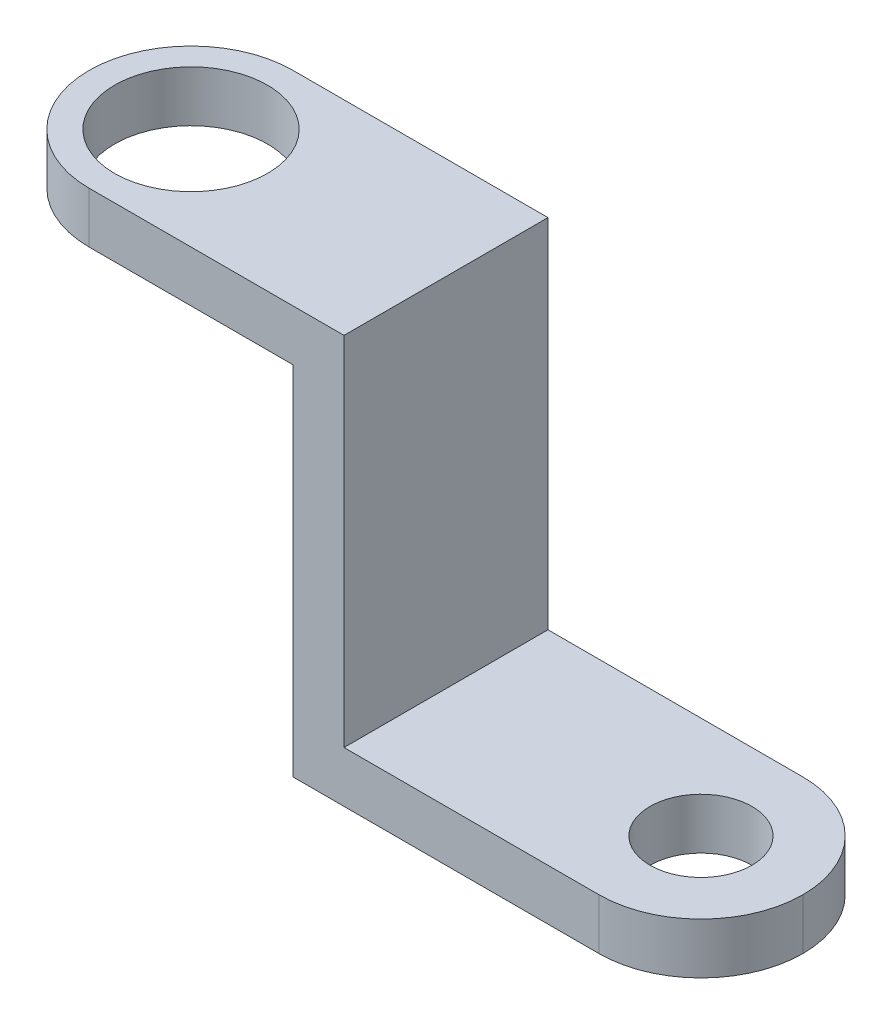
ISO-10303-21;
HEADER;
FILE_DESCRIPTION(('STEP AP214'),'2;1');
FILE_NAME('part.step','',(''),(''),'','','');
FILE_SCHEMA(('AUTOMOTIVE_DESIGN { 1 0 10303 214 1 1 1 1 }'));
ENDSEC;
DATA;
#1=APPLICATION_CONTEXT('core data for automotive mechanical design processes');
#2=APPLICATION_PROTOCOL_DEFINITION('international standard','automotive_design',2000,#1);
#3=PRODUCT_CONTEXT('',#1,'mechanical');
#4=PRODUCT('Part','Part','',(#3));
#5=PRODUCT_RELATED_PRODUCT_CATEGORY('part','',(#4));
#6=PRODUCT_DEFINITION_FORMATION('','',#4);
#7=PRODUCT_DEFINITION_CONTEXT('part definition',#1,'design');
#8=PRODUCT_DEFINITION('design','',#6,#7);
#9=PRODUCT_DEFINITION_SHAPE('','',#8);
#10=(LENGTH_UNIT() NAMED_UNIT(*) SI_UNIT(.MILLI.,.METRE.));
#11=(NAMED_UNIT(*) PLANE_ANGLE_UNIT() SI_UNIT($,.RADIAN.));
#12=(NAMED_UNIT(*) SI_UNIT($,.STERADIAN.) SOLID_ANGLE_UNIT());
#13=UNCERTAINTY_MEASURE_WITH_UNIT(LENGTH_MEASURE(1.E-05),#10,'distance_accuracy_value','');
#14=(GEOMETRIC_REPRESENTATION_CONTEXT(3) GLOBAL_UNCERTAINTY_ASSIGNED_CONTEXT((#13)) GLOBAL_UNIT_ASSIGNED_CONTEXT((#10,
#11,#12)) REPRESENTATION_CONTEXT('',''));
#15=CARTESIAN_POINT('',(0.,0.,0.));
#16=DIRECTION('',(0.,0.,1.));
#17=DIRECTION('',(1.,0.,0.));
#18=AXIS2_PLACEMENT_3D('',#15,#16,#17);
#19=CARTESIAN_POINT('',(-38.1,44.45,25.4));
#20=DIRECTION('',(0.,1.,0.));
#21=DIRECTION('',(0.,0.,1.));
#22=AXIS2_PLACEMENT_3D('',#19,#20,#21);
#23=PLANE('',#22);
#24=CARTESIAN_POINT('',(-25.4,44.45,12.7));
#25=DIRECTION('',(0.,1.,0.));
#26=DIRECTION('',(0.,0.,1.));
#27=AXIS2_PLACEMENT_3D('',#24,#25,#26);
#28=CIRCLE('',#27,9.52499999999999);
#29=CARTESIAN_POINT('',(-25.4,44.45,22.225));
#30=VERTEX_POINT('',#29);
#31=EDGE_CURVE('E227',#30,#30,#28,.T.);
#32=ORIENTED_EDGE('',*,*,#31,.T.);
#33=EDGE_LOOP('',(#32));
#34=FACE_BOUND('',#33,.T.);
#35=CARTESIAN_POINT('',(-25.4,44.45,12.7));
#36=DIRECTION('',(0.,1.,0.));
#37=DIRECTION('',(0.,0.,1.));
#38=AXIS2_PLACEMENT_3D('',#35,#36,#37);
#39=CIRCLE('',#38,12.7);
#40=CARTESIAN_POINT('',(-25.4,44.45,25.4));
#41=VERTEX_POINT('',#40);
#42=CARTESIAN_POINT('',(-38.1,44.45,12.7));
#43=VERTEX_POINT('',#42);
#44=EDGE_CURVE('E209',#41,#43,#39,.F.);
#45=ORIENTED_EDGE('',*,*,#44,.T.);
#46=CARTESIAN_POINT('',(-25.4,44.45,12.7));
#47=DIRECTION('',(0.,1.,0.));
#48=DIRECTION('',(0.,0.,1.));
#49=AXIS2_PLACEMENT_3D('',#46,#47,#48);
#50=CIRCLE('',#49,12.7);
#51=CARTESIAN_POINT('',(-25.4,44.45,0.));
#52=VERTEX_POINT('',#51);
#53=EDGE_CURVE('E212',#43,#52,#50,.F.);
#54=ORIENTED_EDGE('',*,*,#53,.T.);
#55=DIRECTION('',(1.,0.,0.));
#56=VECTOR('',#55,1.);
#57=CARTESIAN_POINT('',(-38.1,44.45,0.));
#58=LINE('',#57,#56);
#59=CARTESIAN_POINT('',(0.,44.45,0.));
#60=VERTEX_POINT('',#59);
#61=EDGE_CURVE('E136',#52,#60,#58,.T.);
#62=ORIENTED_EDGE('',*,*,#61,.T.);
#63=DIRECTION('',(0.,0.,-1.));
#64=VECTOR('',#63,1.);
#65=CARTESIAN_POINT('',(0.,44.45,25.4));
#66=LINE('',#65,#64);
#67=CARTESIAN_POINT('',(0.,44.45,25.4));
#68=VERTEX_POINT('',#67);
#69=EDGE_CURVE('E134',#68,#60,#66,.T.);
#70=ORIENTED_EDGE('',*,*,#69,.F.);
#71=DIRECTION('',(1.,0.,0.));
#72=VECTOR('',#71,1.);
#73=CARTESIAN_POINT('',(-38.1,44.45,25.4));
#74=LINE('',#73,#72);
#75=EDGE_CURVE('E120',#41,#68,#74,.T.);
#76=ORIENTED_EDGE('',*,*,#75,.F.);
#77=EDGE_LOOP('',(#45,#54,#62,#70,#76));
#78=FACE_BOUND('',#77,.T.);
#79=ADVANCED_FACE('F43',(#34,#78),#23,.F.);
#80=CARTESIAN_POINT('',(0.,44.45,25.4));
#81=DIRECTION('',(1.,0.,0.));
#82=DIRECTION('',(0.,1.,0.));
#83=AXIS2_PLACEMENT_3D('',#80,#81,#82);
#84=PLANE('',#83);
#85=DIRECTION('',(0.,-1.,0.));
#86=VECTOR('',#85,1.);
#87=CARTESIAN_POINT('',(0.,44.45,0.));
#88=LINE('',#87,#86);
#89=CARTESIAN_POINT('',(0.,0.,0.));
#90=VERTEX_POINT('',#89);
#91=EDGE_CURVE('E165',#60,#90,#88,.T.);
#92=ORIENTED_EDGE('',*,*,#91,.T.);
#93=DIRECTION('',(0.,0.,-1.));
#94=VECTOR('',#93,1.);
#95=CARTESIAN_POINT('',(0.,0.,25.4));
#96=LINE('',#95,#94);
#97=CARTESIAN_POINT('',(0.,0.,25.4));
#98=VERTEX_POINT('',#97);
#99=EDGE_CURVE('E141',#98,#90,#96,.T.);
#100=ORIENTED_EDGE('',*,*,#99,.F.);
#101=DIRECTION('',(0.,-1.,0.));
#102=VECTOR('',#101,1.);
#103=CARTESIAN_POINT('',(0.,44.45,25.4));
#104=LINE('',#103,#102);
#105=EDGE_CURVE('E125',#68,#98,#104,.T.);
#106=ORIENTED_EDGE('',*,*,#105,.F.);
#107=ORIENTED_EDGE('',*,*,#69,.T.);
#108=EDGE_LOOP('',(#92,#100,#106,#107));
#109=FACE_BOUND('',#108,.T.);
#110=ADVANCED_FACE('F143',(#109),#84,.F.);
#111=CARTESIAN_POINT('',(0.,0.,25.4));
#112=DIRECTION('',(0.,1.,0.));
#113=DIRECTION('',(0.,0.,1.));
#114=AXIS2_PLACEMENT_3D('',#111,#112,#113);
#115=PLANE('',#114);
#116=CARTESIAN_POINT('',(38.1,0.,12.7));
#117=DIRECTION('',(0.,1.,0.));
#118=DIRECTION('',(0.,0.,1.));
#119=AXIS2_PLACEMENT_3D('',#116,#117,#118);
#120=CIRCLE('',#119,6.34999999999999);
#121=CARTESIAN_POINT('',(38.1,0.,19.05));
#122=VERTEX_POINT('',#121);
#123=EDGE_CURVE('E238',#122,#122,#120,.T.);
#124=ORIENTED_EDGE('',*,*,#123,.T.);
#125=EDGE_LOOP('',(#124));
#126=FACE_BOUND('',#125,.T.);
#127=DIRECTION('',(1.,0.,0.));
#128=VECTOR('',#127,1.);
#129=CARTESIAN_POINT('',(0.,0.,0.));
#130=LINE('',#129,#128);
#131=CARTESIAN_POINT('',(38.1,0.,0.));
#132=VERTEX_POINT('',#131);
#133=EDGE_CURVE('E169',#90,#132,#130,.T.);
#134=ORIENTED_EDGE('',*,*,#133,.T.);
#135=CARTESIAN_POINT('',(38.1,0.,12.7));
#136=DIRECTION('',(0.,1.,0.));
#137=DIRECTION('',(0.,0.,1.));
#138=AXIS2_PLACEMENT_3D('',#135,#136,#137);
#139=CIRCLE('',#138,12.7);
#140=CARTESIAN_POINT('',(50.8,0.,12.7));
#141=VERTEX_POINT('',#140);
#142=EDGE_CURVE('E206',#132,#141,#139,.F.);
#143=ORIENTED_EDGE('',*,*,#142,.T.);
#144=CARTESIAN_POINT('',(38.1,0.,12.7));
#145=DIRECTION('',(0.,1.,0.));
#146=DIRECTION('',(0.,0.,1.));
#147=AXIS2_PLACEMENT_3D('',#144,#145,#146);
#148=CIRCLE('',#147,12.7);
#149=CARTESIAN_POINT('',(38.1,0.,25.4));
#150=VERTEX_POINT('',#149);
#151=EDGE_CURVE('E203',#141,#150,#148,.F.);
#152=ORIENTED_EDGE('',*,*,#151,.T.);
#153=DIRECTION('',(1.,0.,0.));
#154=VECTOR('',#153,1.);
#155=CARTESIAN_POINT('',(0.,0.,25.4));
#156=LINE('',#155,#154);
#157=EDGE_CURVE('E147',#98,#150,#156,.T.);
#158=ORIENTED_EDGE('',*,*,#157,.F.);
#159=ORIENTED_EDGE('',*,*,#99,.T.);
#160=EDGE_LOOP('',(#134,#143,#152,#158,#159));
#161=FACE_BOUND('',#160,.T.);
#162=ADVANCED_FACE('F255',(#126,#161),#115,.F.);
#163=CARTESIAN_POINT('',(50.8,6.35,25.4));
#164=DIRECTION('',(0.,-1.,0.));
#165=DIRECTION('',(1.,0.,0.));
#166=AXIS2_PLACEMENT_3D('',#163,#164,#165);
#167=PLANE('',#166);
#168=CARTESIAN_POINT('',(38.1,6.35,12.7));
#169=DIRECTION('',(0.,1.,0.));
#170=DIRECTION('',(0.,0.,1.));
#171=AXIS2_PLACEMENT_3D('',#168,#169,#170);
#172=CIRCLE('',#171,6.34999999999999);
#173=CARTESIAN_POINT('',(38.1,6.35,19.05));
#174=VERTEX_POINT('',#173);
#175=EDGE_CURVE('E244',#174,#174,#172,.T.);
#176=ORIENTED_EDGE('',*,*,#175,.F.);
#177=EDGE_LOOP('',(#176));
#178=FACE_BOUND('',#177,.T.);
#179=CARTESIAN_POINT('',(38.1,6.35,12.7));
#180=DIRECTION('',(0.,-1.,0.));
#181=DIRECTION('',(1.,0.,0.));
#182=AXIS2_PLACEMENT_3D('',#179,#180,#181);
#183=CIRCLE('',#182,12.7);
#184=CARTESIAN_POINT('',(38.1,6.35,25.4));
#185=VERTEX_POINT('',#184);
#186=CARTESIAN_POINT('',(50.8,6.35,12.7));
#187=VERTEX_POINT('',#186);
#188=EDGE_CURVE('E140',#185,#187,#183,.F.);
#189=ORIENTED_EDGE('',*,*,#188,.T.);
#190=CARTESIAN_POINT('',(38.1,6.35,12.7));
#191=DIRECTION('',(0.,-1.,0.));
#192=DIRECTION('',(1.,0.,0.));
#193=AXIS2_PLACEMENT_3D('',#190,#191,#192);
#194=CIRCLE('',#193,12.7);
#195=CARTESIAN_POINT('',(38.1,6.35,0.));
#196=VERTEX_POINT('',#195);
#197=EDGE_CURVE('E192',#187,#196,#194,.F.);
#198=ORIENTED_EDGE('',*,*,#197,.T.);
#199=DIRECTION('',(-1.,0.,0.));
#200=VECTOR('',#199,1.);
#201=CARTESIAN_POINT('',(50.8,6.35,0.));
#202=LINE('',#201,#200);
#203=CARTESIAN_POINT('',(6.35,6.35,0.));
#204=VERTEX_POINT('',#203);
#205=EDGE_CURVE('E173',#196,#204,#202,.T.);
#206=ORIENTED_EDGE('',*,*,#205,.T.);
#207=DIRECTION('',(0.,0.,-1.));
#208=VECTOR('',#207,1.);
#209=CARTESIAN_POINT('',(6.35,6.35,25.4));
#210=LINE('',#209,#208);
#211=CARTESIAN_POINT('',(6.35,6.35,25.4));
#212=VERTEX_POINT('',#211);
#213=EDGE_CURVE('E184',#212,#204,#210,.T.);
#214=ORIENTED_EDGE('',*,*,#213,.F.);
#215=DIRECTION('',(-1.,0.,0.));
#216=VECTOR('',#215,1.);
#217=CARTESIAN_POINT('',(50.8,6.35,25.4));
#218=LINE('',#217,#216);
#219=EDGE_CURVE('E150',#185,#212,#218,.T.);
#220=ORIENTED_EDGE('',*,*,#219,.F.);
#221=EDGE_LOOP('',(#189,#198,#206,#214,#220));
#222=FACE_BOUND('',#221,.T.);
#223=ADVANCED_FACE('F251',(#178,#222),#167,.F.);
#224=CARTESIAN_POINT('',(6.35,6.35,25.4));
#225=DIRECTION('',(-1.,0.,0.));
#226=DIRECTION('',(0.,-1.,0.));
#227=AXIS2_PLACEMENT_3D('',#224,#225,#226);
#228=PLANE('',#227);
#229=DIRECTION('',(0.,1.,0.));
#230=VECTOR('',#229,1.);
#231=CARTESIAN_POINT('',(6.35,6.35,0.));
#232=LINE('',#231,#230);
#233=CARTESIAN_POINT('',(6.35,50.8,0.));
#234=VERTEX_POINT('',#233);
#235=EDGE_CURVE('E176',#204,#234,#232,.T.);
#236=ORIENTED_EDGE('',*,*,#235,.T.);
#237=DIRECTION('',(0.,0.,-1.));
#238=VECTOR('',#237,1.);
#239=CARTESIAN_POINT('',(6.35,50.8,25.4));
#240=LINE('',#239,#238);
#241=CARTESIAN_POINT('',(6.35,50.8,25.4));
#242=VERTEX_POINT('',#241);
#243=EDGE_CURVE('E162',#242,#234,#240,.T.);
#244=ORIENTED_EDGE('',*,*,#243,.F.);
#245=DIRECTION('',(0.,1.,0.));
#246=VECTOR('',#245,1.);
#247=CARTESIAN_POINT('',(6.35,6.35,25.4));
#248=LINE('',#247,#246);
#249=EDGE_CURVE('E156',#212,#242,#248,.T.);
#250=ORIENTED_EDGE('',*,*,#249,.F.);
#251=ORIENTED_EDGE('',*,*,#213,.T.);
#252=EDGE_LOOP('',(#236,#244,#250,#251));
#253=FACE_BOUND('',#252,.T.);
#254=ADVANCED_FACE('F254',(#253),#228,.F.);
#255=CARTESIAN_POINT('',(6.35,50.8,25.4));
#256=DIRECTION('',(0.,-1.,0.));
#257=DIRECTION('',(0.,0.,-1.));
#258=AXIS2_PLACEMENT_3D('',#255,#256,#257);
#259=PLANE('',#258);
#260=CARTESIAN_POINT('',(-25.4,50.8,12.7));
#261=DIRECTION('',(0.,1.,0.));
#262=DIRECTION('',(0.,0.,1.));
#263=AXIS2_PLACEMENT_3D('',#260,#261,#262);
#264=CIRCLE('',#263,9.52499999999999);
#265=CARTESIAN_POINT('',(-25.4,50.8,22.225));
#266=VERTEX_POINT('',#265);
#267=EDGE_CURVE('E233',#266,#266,#264,.T.);
#268=ORIENTED_EDGE('',*,*,#267,.F.);
#269=EDGE_LOOP('',(#268));
#270=FACE_BOUND('',#269,.T.);
#271=DIRECTION('',(-1.,0.,0.));
#272=VECTOR('',#271,1.);
#273=CARTESIAN_POINT('',(6.35,50.8,0.));
#274=LINE('',#273,#272);
#275=CARTESIAN_POINT('',(-25.4,50.8,0.));
#276=VERTEX_POINT('',#275);
#277=EDGE_CURVE('E131',#234,#276,#274,.T.);
#278=ORIENTED_EDGE('',*,*,#277,.T.);
#279=CARTESIAN_POINT('',(-25.4,50.8,12.7));
#280=DIRECTION('',(0.,-1.,0.));
#281=DIRECTION('',(0.,0.,-1.));
#282=AXIS2_PLACEMENT_3D('',#279,#280,#281);
#283=CIRCLE('',#282,12.7);
#284=CARTESIAN_POINT('',(-38.1,50.8,12.7));
#285=VERTEX_POINT('',#284);
#286=EDGE_CURVE('E66',#276,#285,#283,.F.);
#287=ORIENTED_EDGE('',*,*,#286,.T.);
#288=CARTESIAN_POINT('',(-25.4,50.8,12.7));
#289=DIRECTION('',(0.,-1.,0.));
#290=DIRECTION('',(0.,0.,-1.));
#291=AXIS2_PLACEMENT_3D('',#288,#289,#290);
#292=CIRCLE('',#291,12.7);
#293=CARTESIAN_POINT('',(-25.4,50.8,25.4));
#294=VERTEX_POINT('',#293);
#295=EDGE_CURVE('E61',#285,#294,#292,.F.);
#296=ORIENTED_EDGE('',*,*,#295,.T.);
#297=DIRECTION('',(-1.,0.,0.));
#298=VECTOR('',#297,1.);
#299=CARTESIAN_POINT('',(6.35,50.8,25.4));
#300=LINE('',#299,#298);
#301=EDGE_CURVE('E159',#242,#294,#300,.T.);
#302=ORIENTED_EDGE('',*,*,#301,.F.);
#303=ORIENTED_EDGE('',*,*,#243,.T.);
#304=EDGE_LOOP('',(#278,#287,#296,#302,#303));
#305=FACE_BOUND('',#304,.T.);
#306=ADVANCED_FACE('F276',(#270,#305),#259,.F.);
#307=CARTESIAN_POINT('',(0.,0.,25.4));
#308=DIRECTION('',(0.,0.,1.));
#309=DIRECTION('',(1.,0.,0.));
#310=AXIS2_PLACEMENT_3D('',#307,#308,#309);
#311=PLANE('',#310);
#312=ORIENTED_EDGE('',*,*,#157,.T.);
#313=DIRECTION('',(0.,1.,0.));
#314=VECTOR('',#313,1.);
#315=CARTESIAN_POINT('',(38.1,6.35,25.4));
#316=LINE('',#315,#314);
#317=EDGE_CURVE('E11',#150,#185,#316,.T.);
#318=ORIENTED_EDGE('',*,*,#317,.T.);
#319=ORIENTED_EDGE('',*,*,#219,.T.);
#320=ORIENTED_EDGE('',*,*,#249,.T.);
#321=ORIENTED_EDGE('',*,*,#301,.T.);
#322=DIRECTION('',(0.,-1.,0.));
#323=VECTOR('',#322,1.);
#324=CARTESIAN_POINT('',(-25.4,44.45,25.4));
#325=LINE('',#324,#323);
#326=EDGE_CURVE('E53',#294,#41,#325,.T.);
#327=ORIENTED_EDGE('',*,*,#326,.T.);
#328=ORIENTED_EDGE('',*,*,#75,.T.);
#329=ORIENTED_EDGE('',*,*,#105,.T.);
#330=EDGE_LOOP('',(#312,#318,#319,#320,#321,#327,#328,#329));
#331=FACE_BOUND('',#330,.T.);
#332=ADVANCED_FACE('F123',(#331),#311,.T.);
#333=CARTESIAN_POINT('',(0.,0.,0.));
#334=DIRECTION('',(0.,0.,1.));
#335=DIRECTION('',(1.,0.,0.));
#336=AXIS2_PLACEMENT_3D('',#333,#334,#335);
#337=PLANE('',#336);
#338=ORIENTED_EDGE('',*,*,#205,.F.);
#339=DIRECTION('',(0.,1.,0.));
#340=VECTOR('',#339,1.);
#341=CARTESIAN_POINT('',(38.1,0.,0.));
#342=LINE('',#341,#340);
#343=EDGE_CURVE('E199',#196,#132,#342,.F.);
#344=ORIENTED_EDGE('',*,*,#343,.T.);
#345=ORIENTED_EDGE('',*,*,#133,.F.);
#346=ORIENTED_EDGE('',*,*,#91,.F.);
#347=ORIENTED_EDGE('',*,*,#61,.F.);
#348=DIRECTION('',(0.,-1.,0.));
#349=VECTOR('',#348,1.);
#350=CARTESIAN_POINT('',(-25.4,0.,0.));
#351=LINE('',#350,#349);
#352=EDGE_CURVE('E195',#52,#276,#351,.F.);
#353=ORIENTED_EDGE('',*,*,#352,.T.);
#354=ORIENTED_EDGE('',*,*,#277,.F.);
#355=ORIENTED_EDGE('',*,*,#235,.F.);
#356=EDGE_LOOP('',(#338,#344,#345,#346,#347,#353,#354,#355));
#357=FACE_BOUND('',#356,.T.);
#358=ADVANCED_FACE('F269',(#357),#337,.F.);
#359=CARTESIAN_POINT('',(38.1,0.,12.7));
#360=DIRECTION('',(0.,-1.,0.));
#361=DIRECTION('',(0.,0.,-1.));
#362=AXIS2_PLACEMENT_3D('',#359,#360,#361);
#363=CYLINDRICAL_SURFACE('',#362,12.7);
#364=ORIENTED_EDGE('',*,*,#317,.F.);
#365=ORIENTED_EDGE('',*,*,#151,.F.);
#366=DIRECTION('',(0.,1.,0.));
#367=VECTOR('',#366,1.);
#368=CARTESIAN_POINT('',(50.8,0.,12.7));
#369=LINE('',#368,#367);
#370=EDGE_CURVE('E166',#187,#141,#369,.F.);
#371=ORIENTED_EDGE('',*,*,#370,.F.);
#372=ORIENTED_EDGE('',*,*,#188,.F.);
#373=EDGE_LOOP('',(#364,#365,#371,#372));
#374=FACE_BOUND('',#373,.T.);
#375=ADVANCED_FACE('F264',(#374),#363,.T.);
#376=CARTESIAN_POINT('',(38.1,0.,12.7));
#377=DIRECTION('',(0.,1.,0.));
#378=DIRECTION('',(0.,0.,1.));
#379=AXIS2_PLACEMENT_3D('',#376,#377,#378);
#380=CYLINDRICAL_SURFACE('',#379,12.7);
#381=ORIENTED_EDGE('',*,*,#142,.F.);
#382=ORIENTED_EDGE('',*,*,#343,.F.);
#383=ORIENTED_EDGE('',*,*,#197,.F.);
#384=ORIENTED_EDGE('',*,*,#370,.T.);
#385=EDGE_LOOP('',(#381,#382,#383,#384));
#386=FACE_BOUND('',#385,.T.);
#387=ADVANCED_FACE('F266',(#386),#380,.T.);
#388=CARTESIAN_POINT('',(-25.4,0.,12.7));
#389=DIRECTION('',(0.,1.,0.));
#390=DIRECTION('',(-1.,0.,0.));
#391=AXIS2_PLACEMENT_3D('',#388,#389,#390);
#392=CYLINDRICAL_SURFACE('',#391,12.7);
#393=ORIENTED_EDGE('',*,*,#326,.F.);
#394=ORIENTED_EDGE('',*,*,#295,.F.);
#395=DIRECTION('',(0.,-1.,0.));
#396=VECTOR('',#395,1.);
#397=CARTESIAN_POINT('',(-38.1,50.8,12.7));
#398=LINE('',#397,#396);
#399=EDGE_CURVE('E47',#43,#285,#398,.F.);
#400=ORIENTED_EDGE('',*,*,#399,.F.);
#401=ORIENTED_EDGE('',*,*,#44,.F.);
#402=EDGE_LOOP('',(#393,#394,#400,#401));
#403=FACE_BOUND('',#402,.T.);
#404=ADVANCED_FACE('F45',(#403),#392,.T.);
#405=CARTESIAN_POINT('',(-25.4,50.8,12.7));
#406=DIRECTION('',(0.,-1.,0.));
#407=DIRECTION('',(1.,0.,0.));
#408=AXIS2_PLACEMENT_3D('',#405,#406,#407);
#409=CYLINDRICAL_SURFACE('',#408,12.7);
#410=ORIENTED_EDGE('',*,*,#286,.F.);
#411=ORIENTED_EDGE('',*,*,#352,.F.);
#412=ORIENTED_EDGE('',*,*,#53,.F.);
#413=ORIENTED_EDGE('',*,*,#399,.T.);
#414=EDGE_LOOP('',(#410,#411,#412,#413));
#415=FACE_BOUND('',#414,.T.);
#416=ADVANCED_FACE('F279',(#415),#409,.T.);
#417=CARTESIAN_POINT('',(-25.4,50.8,12.7));
#418=DIRECTION('',(0.,1.,0.));
#419=DIRECTION('',(0.,0.,1.));
#420=AXIS2_PLACEMENT_3D('',#417,#418,#419);
#421=CYLINDRICAL_SURFACE('',#420,9.52499999999999);
#422=ORIENTED_EDGE('',*,*,#267,.T.);
#423=EDGE_LOOP('',(#422));
#424=FACE_BOUND('',#423,.T.);
#425=ORIENTED_EDGE('',*,*,#31,.F.);
#426=EDGE_LOOP('',(#425));
#427=FACE_BOUND('',#426,.T.);
#428=ADVANCED_FACE('F281',(#424,#427),#421,.F.);
#429=CARTESIAN_POINT('',(38.1,6.35,12.7));
#430=DIRECTION('',(0.,1.,0.));
#431=DIRECTION('',(0.,0.,1.));
#432=AXIS2_PLACEMENT_3D('',#429,#430,#431);
#433=CYLINDRICAL_SURFACE('',#432,6.34999999999999);
#434=ORIENTED_EDGE('',*,*,#123,.F.);
#435=EDGE_LOOP('',(#434));
#436=FACE_BOUND('',#435,.T.);
#437=ORIENTED_EDGE('',*,*,#175,.T.);
#438=EDGE_LOOP('',(#437));
#439=FACE_BOUND('',#438,.T.);
#440=ADVANCED_FACE('F249',(#436,#439),#433,.F.);
#441=CLOSED_SHELL('',(#79,#110,#162,#223,#254,#306,#332,#358,#375,#387,#404,#416,#428,#440));
#442=MANIFOLD_SOLID_BREP('B2',#441);
#443=ADVANCED_BREP_SHAPE_REPRESENTATION('',(#18,#442),#14);
#444=SHAPE_DEFINITION_REPRESENTATION(#9,#443);
ENDSEC;
END-ISO-10303-21;
